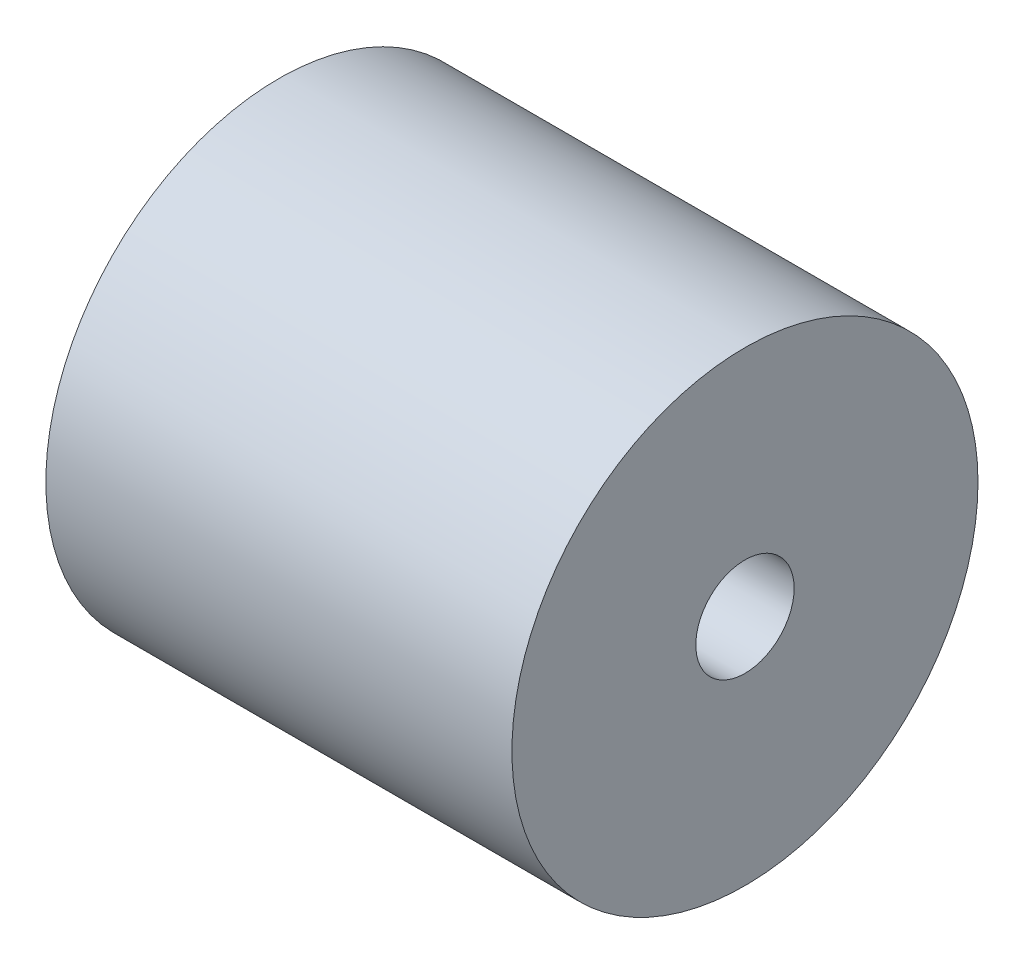
ISO-10303-21;
HEADER;
FILE_DESCRIPTION(('STEP AP214'),'2;1');
FILE_NAME('part.step','',(''),(''),'','','');
FILE_SCHEMA(('AUTOMOTIVE_DESIGN { 1 0 10303 214 1 1 1 1 }'));
ENDSEC;
DATA;
#1=APPLICATION_CONTEXT('core data for automotive mechanical design processes');
#2=APPLICATION_PROTOCOL_DEFINITION('international standard','automotive_design',2000,#1);
#3=PRODUCT_CONTEXT('',#1,'mechanical');
#4=PRODUCT('Part','Part','',(#3));
#5=PRODUCT_RELATED_PRODUCT_CATEGORY('part','',(#4));
#6=PRODUCT_DEFINITION_FORMATION('','',#4);
#7=PRODUCT_DEFINITION_CONTEXT('part definition',#1,'design');
#8=PRODUCT_DEFINITION('design','',#6,#7);
#9=PRODUCT_DEFINITION_SHAPE('','',#8);
#10=(LENGTH_UNIT() NAMED_UNIT(*) SI_UNIT(.MILLI.,.METRE.));
#11=(NAMED_UNIT(*) PLANE_ANGLE_UNIT() SI_UNIT($,.RADIAN.));
#12=(NAMED_UNIT(*) SI_UNIT($,.STERADIAN.) SOLID_ANGLE_UNIT());
#13=UNCERTAINTY_MEASURE_WITH_UNIT(LENGTH_MEASURE(1.E-05),#10,'distance_accuracy_value','');
#14=(GEOMETRIC_REPRESENTATION_CONTEXT(3) GLOBAL_UNCERTAINTY_ASSIGNED_CONTEXT((#13)) GLOBAL_UNIT_ASSIGNED_CONTEXT((#10,
#11,#12)) REPRESENTATION_CONTEXT('',''));
#15=CARTESIAN_POINT('',(0.,0.,0.));
#16=DIRECTION('',(0.,0.,1.));
#17=DIRECTION('',(1.,0.,0.));
#18=AXIS2_PLACEMENT_3D('',#15,#16,#17);
#19=CARTESIAN_POINT('',(50.,0.,0.));
#20=DIRECTION('',(-1.,0.,0.));
#21=DIRECTION('',(0.,0.,1.));
#22=AXIS2_PLACEMENT_3D('',#19,#20,#21);
#23=CYLINDRICAL_SURFACE('',#22,25.);
#24=CARTESIAN_POINT('',(50.,0.,0.));
#25=DIRECTION('',(1.,0.,0.));
#26=DIRECTION('',(0.,0.,-1.));
#27=AXIS2_PLACEMENT_3D('',#24,#25,#26);
#28=CIRCLE('',#27,25.);
#29=CARTESIAN_POINT('',(50.,0.,-25.));
#30=VERTEX_POINT('',#29);
#31=EDGE_CURVE('E10',#30,#30,#28,.T.);
#32=ORIENTED_EDGE('',*,*,#31,.F.);
#33=EDGE_LOOP('',(#32));
#34=FACE_BOUND('',#33,.T.);
#35=CARTESIAN_POINT('',(0.,0.,0.));
#36=DIRECTION('',(1.,0.,0.));
#37=DIRECTION('',(0.,0.,-1.));
#38=AXIS2_PLACEMENT_3D('',#35,#36,#37);
#39=CIRCLE('',#38,25.);
#40=CARTESIAN_POINT('',(0.,0.,-25.));
#41=VERTEX_POINT('',#40);
#42=EDGE_CURVE('E38',#41,#41,#39,.T.);
#43=ORIENTED_EDGE('',*,*,#42,.T.);
#44=EDGE_LOOP('',(#43));
#45=FACE_BOUND('',#44,.T.);
#46=ADVANCED_FACE('F35',(#34,#45),#23,.T.);
#47=CARTESIAN_POINT('',(50.,0.,0.));
#48=DIRECTION('',(1.,0.,0.));
#49=DIRECTION('',(0.,0.,-1.));
#50=AXIS2_PLACEMENT_3D('',#47,#48,#49);
#51=PLANE('',#50);
#52=CARTESIAN_POINT('',(50.,0.,0.));
#53=DIRECTION('',(1.,0.,0.));
#54=DIRECTION('',(0.,0.,-1.));
#55=AXIS2_PLACEMENT_3D('',#52,#53,#54);
#56=CIRCLE('',#55,5.275);
#57=CARTESIAN_POINT('',(50.,0.,-5.275));
#58=VERTEX_POINT('',#57);
#59=EDGE_CURVE('E46',#58,#58,#56,.T.);
#60=ORIENTED_EDGE('',*,*,#59,.F.);
#61=EDGE_LOOP('',(#60));
#62=FACE_BOUND('',#61,.T.);
#63=ORIENTED_EDGE('',*,*,#31,.T.);
#64=EDGE_LOOP('',(#63));
#65=FACE_BOUND('',#64,.T.);
#66=ADVANCED_FACE('F82',(#62,#65),#51,.T.);
#67=CARTESIAN_POINT('',(0.,0.,0.));
#68=DIRECTION('',(1.,0.,0.));
#69=DIRECTION('',(0.,0.,-1.));
#70=AXIS2_PLACEMENT_3D('',#67,#68,#69);
#71=PLANE('',#70);
#72=ORIENTED_EDGE('',*,*,#42,.F.);
#73=EDGE_LOOP('',(#72));
#74=FACE_BOUND('',#73,.T.);
#75=ADVANCED_FACE('F87',(#74),#71,.F.);
#76=CARTESIAN_POINT('',(50.,0.,0.));
#77=DIRECTION('',(1.,0.,0.));
#78=DIRECTION('',(0.,0.,-1.));
#79=AXIS2_PLACEMENT_3D('',#76,#77,#78);
#80=CYLINDRICAL_SURFACE('',#79,5.275);
#81=ORIENTED_EDGE('',*,*,#59,.T.);
#82=EDGE_LOOP('',(#81));
#83=FACE_BOUND('',#82,.T.);
#84=CARTESIAN_POINT('',(42.,0.,0.));
#85=DIRECTION('',(1.,0.,0.));
#86=DIRECTION('',(0.,0.,-1.));
#87=AXIS2_PLACEMENT_3D('',#84,#85,#86);
#88=CIRCLE('',#87,5.275);
#89=CARTESIAN_POINT('',(42.,0.,-5.275));
#90=VERTEX_POINT('',#89);
#91=EDGE_CURVE('E50',#90,#90,#88,.T.);
#92=ORIENTED_EDGE('',*,*,#91,.F.);
#93=EDGE_LOOP('',(#92));
#94=FACE_BOUND('',#93,.T.);
#95=ADVANCED_FACE('F94',(#83,#94),#80,.F.);
#96=CARTESIAN_POINT('',(42.,0.,0.));
#97=DIRECTION('',(-1.,0.,0.));
#98=DIRECTION('',(0.,0.,1.));
#99=AXIS2_PLACEMENT_3D('',#96,#97,#98);
#100=PLANE('',#99);
#101=CARTESIAN_POINT('',(42.,0.,0.));
#102=DIRECTION('',(1.,0.,0.));
#103=DIRECTION('',(0.,0.,-1.));
#104=AXIS2_PLACEMENT_3D('',#101,#102,#103);
#105=CIRCLE('',#104,4.67500000000001);
#106=CARTESIAN_POINT('',(42.,0.,-4.67500000000001));
#107=VERTEX_POINT('',#106);
#108=EDGE_CURVE('E53',#107,#107,#105,.T.);
#109=ORIENTED_EDGE('',*,*,#108,.F.);
#110=EDGE_LOOP('',(#109));
#111=FACE_BOUND('',#110,.T.);
#112=ORIENTED_EDGE('',*,*,#91,.T.);
#113=EDGE_LOOP('',(#112));
#114=FACE_BOUND('',#113,.T.);
#115=ADVANCED_FACE('F98',(#111,#114),#100,.F.);
#116=CARTESIAN_POINT('',(50.,0.,0.));
#117=DIRECTION('',(1.,0.,0.));
#118=DIRECTION('',(0.,0.,-1.));
#119=AXIS2_PLACEMENT_3D('',#116,#117,#118);
#120=CYLINDRICAL_SURFACE('',#119,4.67500000000001);
#121=ORIENTED_EDGE('',*,*,#108,.T.);
#122=EDGE_LOOP('',(#121));
#123=FACE_BOUND('',#122,.T.);
#124=CARTESIAN_POINT('',(39.85,0.,0.));
#125=DIRECTION('',(1.,0.,0.));
#126=DIRECTION('',(0.,0.,-1.));
#127=AXIS2_PLACEMENT_3D('',#124,#125,#126);
#128=CIRCLE('',#127,4.67500000000001);
#129=CARTESIAN_POINT('',(39.85,0.,-4.67500000000001));
#130=VERTEX_POINT('',#129);
#131=EDGE_CURVE('E56',#130,#130,#128,.T.);
#132=ORIENTED_EDGE('',*,*,#131,.F.);
#133=EDGE_LOOP('',(#132));
#134=FACE_BOUND('',#133,.T.);
#135=ADVANCED_FACE('F78',(#123,#134),#120,.F.);
#136=CARTESIAN_POINT('',(39.85,0.,0.));
#137=DIRECTION('',(-1.,0.,0.));
#138=DIRECTION('',(0.,0.,1.));
#139=AXIS2_PLACEMENT_3D('',#136,#137,#138);
#140=PLANE('',#139);
#141=CARTESIAN_POINT('',(39.85,0.,0.));
#142=DIRECTION('',(1.,0.,0.));
#143=DIRECTION('',(0.,0.,-1.));
#144=AXIS2_PLACEMENT_3D('',#141,#142,#143);
#145=CIRCLE('',#144,3.22499999999999);
#146=CARTESIAN_POINT('',(39.85,0.,-3.22499999999999));
#147=VERTEX_POINT('',#146);
#148=EDGE_CURVE('E59',#147,#147,#145,.T.);
#149=ORIENTED_EDGE('',*,*,#148,.F.);
#150=EDGE_LOOP('',(#149));
#151=FACE_BOUND('',#150,.T.);
#152=ORIENTED_EDGE('',*,*,#131,.T.);
#153=EDGE_LOOP('',(#152));
#154=FACE_BOUND('',#153,.T.);
#155=ADVANCED_FACE('F70',(#151,#154),#140,.F.);
#156=CARTESIAN_POINT('',(50.,0.,0.));
#157=DIRECTION('',(1.,0.,0.));
#158=DIRECTION('',(0.,0.,-1.));
#159=AXIS2_PLACEMENT_3D('',#156,#157,#158);
#160=CYLINDRICAL_SURFACE('',#159,3.22499999999999);
#161=ORIENTED_EDGE('',*,*,#148,.T.);
#162=EDGE_LOOP('',(#161));
#163=FACE_BOUND('',#162,.T.);
#164=CARTESIAN_POINT('',(37.5,0.,0.));
#165=DIRECTION('',(1.,0.,0.));
#166=DIRECTION('',(0.,0.,-1.));
#167=AXIS2_PLACEMENT_3D('',#164,#165,#166);
#168=CIRCLE('',#167,3.22499999999999);
#169=CARTESIAN_POINT('',(37.5,0.,-3.22499999999999));
#170=VERTEX_POINT('',#169);
#171=EDGE_CURVE('E62',#170,#170,#168,.T.);
#172=ORIENTED_EDGE('',*,*,#171,.F.);
#173=EDGE_LOOP('',(#172));
#174=FACE_BOUND('',#173,.T.);
#175=ADVANCED_FACE('F68',(#163,#174),#160,.F.);
#176=CARTESIAN_POINT('',(37.5,0.,0.));
#177=DIRECTION('',(1.,0.,0.));
#178=DIRECTION('',(0.,0.,-1.));
#179=AXIS2_PLACEMENT_3D('',#176,#177,#178);
#180=PLANE('',#179);
#181=ORIENTED_EDGE('',*,*,#171,.T.);
#182=EDGE_LOOP('',(#181));
#183=FACE_BOUND('',#182,.T.);
#184=ADVANCED_FACE('F66',(#183),#180,.T.);
#185=CLOSED_SHELL('',(#46,#66,#75,#95,#115,#135,#155,#175,#184));
#186=MANIFOLD_SOLID_BREP('B2',#185);
#187=ADVANCED_BREP_SHAPE_REPRESENTATION('',(#18,#186),#14);
#188=SHAPE_DEFINITION_REPRESENTATION(#9,#187);
ENDSEC;
END-ISO-10303-21;
